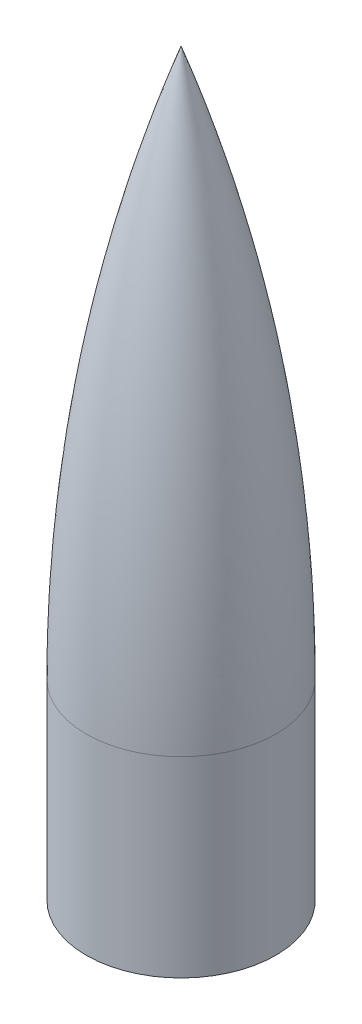
ISO-10303-21;
HEADER;
FILE_DESCRIPTION(('STEP AP214'),'2;1');
FILE_NAME('part.step','',(''),(''),'','','');
FILE_SCHEMA(('AUTOMOTIVE_DESIGN { 1 0 10303 214 1 1 1 1 }'));
ENDSEC;
DATA;
#1=APPLICATION_CONTEXT('core data for automotive mechanical design processes');
#2=APPLICATION_PROTOCOL_DEFINITION('international standard','automotive_design',2000,#1);
#3=PRODUCT_CONTEXT('',#1,'mechanical');
#4=PRODUCT('Part','Part','',(#3));
#5=PRODUCT_RELATED_PRODUCT_CATEGORY('part','',(#4));
#6=PRODUCT_DEFINITION_FORMATION('','',#4);
#7=PRODUCT_DEFINITION_CONTEXT('part definition',#1,'design');
#8=PRODUCT_DEFINITION('design','',#6,#7);
#9=PRODUCT_DEFINITION_SHAPE('','',#8);
#10=(LENGTH_UNIT() NAMED_UNIT(*) SI_UNIT(.MILLI.,.METRE.));
#11=(NAMED_UNIT(*) PLANE_ANGLE_UNIT() SI_UNIT($,.RADIAN.));
#12=(NAMED_UNIT(*) SI_UNIT($,.STERADIAN.) SOLID_ANGLE_UNIT());
#13=UNCERTAINTY_MEASURE_WITH_UNIT(LENGTH_MEASURE(1.E-05),#10,'distance_accuracy_value','');
#14=(GEOMETRIC_REPRESENTATION_CONTEXT(3) GLOBAL_UNCERTAINTY_ASSIGNED_CONTEXT((#13)) GLOBAL_UNIT_ASSIGNED_CONTEXT((#10,
#11,#12)) REPRESENTATION_CONTEXT('',''));
#15=CARTESIAN_POINT('',(0.,0.,0.));
#16=DIRECTION('',(0.,0.,1.));
#17=DIRECTION('',(1.,0.,0.));
#18=AXIS2_PLACEMENT_3D('',#15,#16,#17);
#19=CARTESIAN_POINT('',(0.,0.,-642.333838383836));
#20=DIRECTION('',(-1.,0.,0.));
#21=DIRECTION('',(0.,0.,1.));
#22=AXIS2_PLACEMENT_3D('',#19,#20,#21);
#23=CIRCLE('',#22,681.933838383836);
#24=TRIMMED_CURVE('',#23,(PARAMETER_VALUE(-0.342464720280553)),
(PARAMETER_VALUE(0.342464720280553)),.T.,.PARAMETER.);
#25=CARTESIAN_POINT('',(0.,0.,0.));
#26=DIRECTION('',(0.,1.,0.));
#27=AXIS1_PLACEMENT('',#25,#26);
#28=SURFACE_OF_REVOLUTION('',#24,#27);
#29=CARTESIAN_POINT('',(0.,229.,0.));
#30=VERTEX_POINT('',#29);
#31=VERTEX_LOOP('',#30);
#32=FACE_BOUND('',#31,.T.);
#33=CARTESIAN_POINT('',(0.,0.,0.));
#34=DIRECTION('',(0.,1.,0.));
#35=DIRECTION('',(0.,0.,1.));
#36=AXIS2_PLACEMENT_3D('',#33,#34,#35);
#37=CIRCLE('',#36,39.6);
#38=CARTESIAN_POINT('',(0.,0.,39.6));
#39=VERTEX_POINT('',#38);
#40=EDGE_CURVE('E58',#39,#39,#37,.T.);
#41=ORIENTED_EDGE('',*,*,#40,.T.);
#42=EDGE_LOOP('',(#41));
#43=FACE_BOUND('',#42,.T.);
#44=ADVANCED_FACE('F39',(#32,#43),#28,.T.);
#45=CARTESIAN_POINT('',(0.,0.,-642.333838383836));
#46=DIRECTION('',(-1.,0.,0.));
#47=DIRECTION('',(0.,0.,1.));
#48=AXIS2_PLACEMENT_3D('',#45,#46,#47);
#49=CIRCLE('',#48,678.933838383836);
#50=TRIMMED_CURVE('',#49,(PARAMETER_VALUE(-0.329846882865529)),
(PARAMETER_VALUE(0.329846882865529)),.T.,.PARAMETER.);
#51=CARTESIAN_POINT('',(0.,0.,0.));
#52=DIRECTION('',(0.,1.,0.));
#53=AXIS1_PLACEMENT('',#51,#52);
#54=SURFACE_OF_REVOLUTION('',#50,#53);
#55=CARTESIAN_POINT('',(0.,0.,0.));
#56=DIRECTION('',(0.,1.,0.));
#57=DIRECTION('',(0.,0.,1.));
#58=AXIS2_PLACEMENT_3D('',#55,#56,#57);
#59=CIRCLE('',#58,36.6000000000002);
#60=CARTESIAN_POINT('',(0.,0.,36.6000000000002));
#61=VERTEX_POINT('',#60);
#62=EDGE_CURVE('E11',#61,#61,#59,.T.);
#63=ORIENTED_EDGE('',*,*,#62,.F.);
#64=EDGE_LOOP('',(#63));
#65=FACE_BOUND('',#64,.T.);
#66=CARTESIAN_POINT('',(0.,219.905427331153,0.));
#67=VERTEX_POINT('',#66);
#68=VERTEX_LOOP('',#67);
#69=FACE_BOUND('',#68,.T.);
#70=ADVANCED_FACE('F55',(#65,#69),#54,.F.);
#71=CARTESIAN_POINT('',(0.,229.,0.));
#72=DIRECTION('',(0.,1.,0.));
#73=DIRECTION('',(0.,0.,1.));
#74=AXIS2_PLACEMENT_3D('',#71,#72,#73);
#75=CYLINDRICAL_SURFACE('',#74,36.6000000000002);
#76=CARTESIAN_POINT('',(0.,-80.,0.));
#77=DIRECTION('',(0.,1.,0.));
#78=DIRECTION('',(0.,0.,1.));
#79=AXIS2_PLACEMENT_3D('',#76,#77,#78);
#80=CIRCLE('',#79,36.6000000000002);
#81=CARTESIAN_POINT('',(0.,-80.,36.6000000000002));
#82=VERTEX_POINT('',#81);
#83=EDGE_CURVE('E47',#82,#82,#80,.T.);
#84=ORIENTED_EDGE('',*,*,#83,.F.);
#85=EDGE_LOOP('',(#84));
#86=FACE_BOUND('',#85,.T.);
#87=ORIENTED_EDGE('',*,*,#62,.T.);
#88=EDGE_LOOP('',(#87));
#89=FACE_BOUND('',#88,.T.);
#90=ADVANCED_FACE('F72',(#86,#89),#75,.F.);
#91=CARTESIAN_POINT('',(36.6000000000002,-80.,0.));
#92=DIRECTION('',(0.,1.,0.));
#93=DIRECTION('',(0.,0.,1.));
#94=AXIS2_PLACEMENT_3D('',#91,#92,#93);
#95=PLANE('',#94);
#96=CARTESIAN_POINT('',(0.,-80.,0.));
#97=DIRECTION('',(0.,1.,0.));
#98=DIRECTION('',(0.,0.,1.));
#99=AXIS2_PLACEMENT_3D('',#96,#97,#98);
#100=CIRCLE('',#99,39.6);
#101=CARTESIAN_POINT('',(0.,-80.,39.6));
#102=VERTEX_POINT('',#101);
#103=EDGE_CURVE('E61',#102,#102,#100,.T.);
#104=ORIENTED_EDGE('',*,*,#103,.F.);
#105=EDGE_LOOP('',(#104));
#106=FACE_BOUND('',#105,.T.);
#107=ORIENTED_EDGE('',*,*,#83,.T.);
#108=EDGE_LOOP('',(#107));
#109=FACE_BOUND('',#108,.T.);
#110=ADVANCED_FACE('F70',(#106,#109),#95,.F.);
#111=CARTESIAN_POINT('',(0.,229.,0.));
#112=DIRECTION('',(0.,1.,0.));
#113=DIRECTION('',(0.,0.,1.));
#114=AXIS2_PLACEMENT_3D('',#111,#112,#113);
#115=CYLINDRICAL_SURFACE('',#114,39.6);
#116=ORIENTED_EDGE('',*,*,#40,.F.);
#117=EDGE_LOOP('',(#116));
#118=FACE_BOUND('',#117,.T.);
#119=ORIENTED_EDGE('',*,*,#103,.T.);
#120=EDGE_LOOP('',(#119));
#121=FACE_BOUND('',#120,.T.);
#122=ADVANCED_FACE('F84',(#118,#121),#115,.T.);
#123=CLOSED_SHELL('',(#44,#70,#90,#110,#122));
#124=MANIFOLD_SOLID_BREP('B2',#123);
#125=ADVANCED_BREP_SHAPE_REPRESENTATION('',(#18,#124),#14);
#126=SHAPE_DEFINITION_REPRESENTATION(#9,#125);
ENDSEC;
END-ISO-10303-21;
